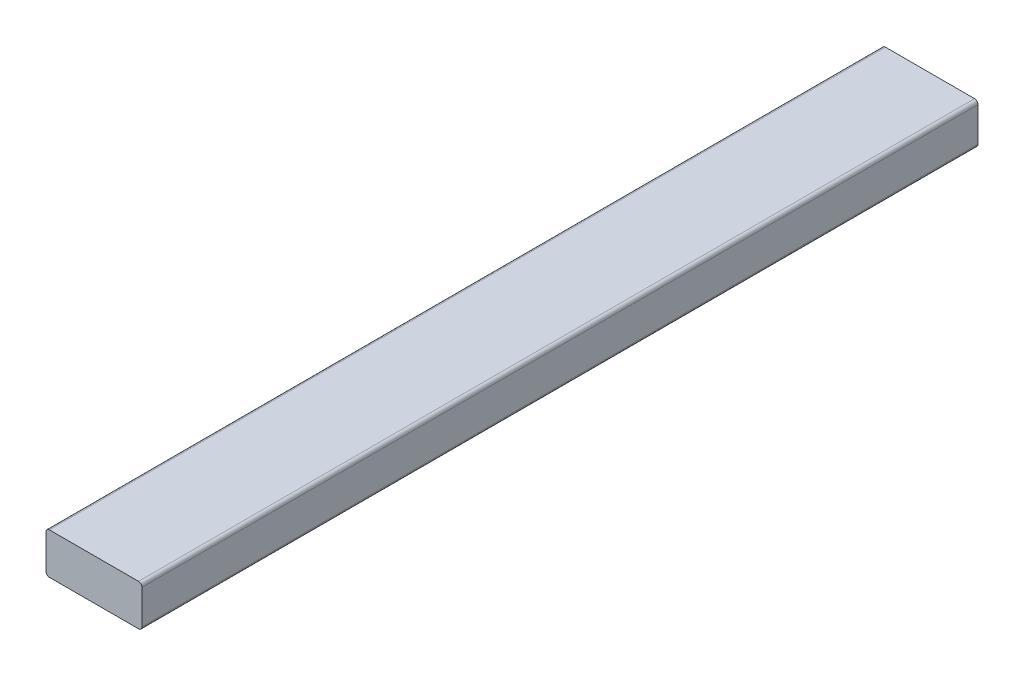
ISO-10303-21;
HEADER;
FILE_DESCRIPTION(('STEP AP214'),'2;1');
FILE_NAME('part.step','',(''),(''),'','','');
FILE_SCHEMA(('AUTOMOTIVE_DESIGN { 1 0 10303 214 1 1 1 1 }'));
ENDSEC;
DATA;
#1=APPLICATION_CONTEXT('core data for automotive mechanical design processes');
#2=APPLICATION_PROTOCOL_DEFINITION('international standard','automotive_design',2000,#1);
#3=PRODUCT_CONTEXT('',#1,'mechanical');
#4=PRODUCT('Part','Part','',(#3));
#5=PRODUCT_RELATED_PRODUCT_CATEGORY('part','',(#4));
#6=PRODUCT_DEFINITION_FORMATION('','',#4);
#7=PRODUCT_DEFINITION_CONTEXT('part definition',#1,'design');
#8=PRODUCT_DEFINITION('design','',#6,#7);
#9=PRODUCT_DEFINITION_SHAPE('','',#8);
#10=(LENGTH_UNIT() NAMED_UNIT(*) SI_UNIT(.MILLI.,.METRE.));
#11=(NAMED_UNIT(*) PLANE_ANGLE_UNIT() SI_UNIT($,.RADIAN.));
#12=(NAMED_UNIT(*) SI_UNIT($,.STERADIAN.) SOLID_ANGLE_UNIT());
#13=UNCERTAINTY_MEASURE_WITH_UNIT(LENGTH_MEASURE(1.E-05),#10,'distance_accuracy_value','');
#14=(GEOMETRIC_REPRESENTATION_CONTEXT(3) GLOBAL_UNCERTAINTY_ASSIGNED_CONTEXT((#13)) GLOBAL_UNIT_ASSIGNED_CONTEXT((#10,
#11,#12)) REPRESENTATION_CONTEXT('',''));
#15=CARTESIAN_POINT('',(0.,0.,0.));
#16=DIRECTION('',(0.,0.,1.));
#17=DIRECTION('',(1.,0.,0.));
#18=AXIS2_PLACEMENT_3D('',#15,#16,#17);
#19=CARTESIAN_POINT('',(44.45,19.05,387.35));
#20=DIRECTION('',(-1.,0.,0.));
#21=DIRECTION('',(0.,0.,1.));
#22=AXIS2_PLACEMENT_3D('',#19,#20,#21);
#23=PLANE('',#22);
#24=DIRECTION('',(0.,1.,0.));
#25=VECTOR('',#24,1.);
#26=CARTESIAN_POINT('',(44.45,19.05,387.35));
#27=LINE('',#26,#25);
#28=CARTESIAN_POINT('',(44.45,-15.875,387.35));
#29=VERTEX_POINT('',#28);
#30=CARTESIAN_POINT('',(44.45,15.875,387.35));
#31=VERTEX_POINT('',#30);
#32=EDGE_CURVE('E119',#29,#31,#27,.T.);
#33=ORIENTED_EDGE('',*,*,#32,.F.);
#34=DIRECTION('',(0.,0.,-1.));
#35=VECTOR('',#34,1.);
#36=CARTESIAN_POINT('',(44.45,-15.875,387.35));
#37=LINE('',#36,#35);
#38=CARTESIAN_POINT('',(44.45,-15.875,-387.35));
#39=VERTEX_POINT('',#38);
#40=EDGE_CURVE('E104',#29,#39,#37,.T.);
#41=ORIENTED_EDGE('',*,*,#40,.T.);
#42=DIRECTION('',(0.,1.,0.));
#43=VECTOR('',#42,1.);
#44=CARTESIAN_POINT('',(44.45,19.05,-387.35));
#45=LINE('',#44,#43);
#46=CARTESIAN_POINT('',(44.45,15.875,-387.35));
#47=VERTEX_POINT('',#46);
#48=EDGE_CURVE('E116',#39,#47,#45,.T.);
#49=ORIENTED_EDGE('',*,*,#48,.T.);
#50=DIRECTION('',(0.,0.,-1.));
#51=VECTOR('',#50,1.);
#52=CARTESIAN_POINT('',(44.45,15.875,387.35));
#53=LINE('',#52,#51);
#54=EDGE_CURVE('E121',#47,#31,#53,.F.);
#55=ORIENTED_EDGE('',*,*,#54,.T.);
#56=EDGE_LOOP('',(#33,#41,#49,#55));
#57=FACE_BOUND('',#56,.T.);
#58=ADVANCED_FACE('F34',(#57),#23,.F.);
#59=CARTESIAN_POINT('',(-44.45,19.05,387.35));
#60=DIRECTION('',(0.,-1.,0.));
#61=DIRECTION('',(0.,0.,-1.));
#62=AXIS2_PLACEMENT_3D('',#59,#60,#61);
#63=PLANE('',#62);
#64=DIRECTION('',(-1.,0.,0.));
#65=VECTOR('',#64,1.);
#66=CARTESIAN_POINT('',(-44.45,19.05,-387.35));
#67=LINE('',#66,#65);
#68=CARTESIAN_POINT('',(41.275,19.05,-387.35));
#69=VERTEX_POINT('',#68);
#70=CARTESIAN_POINT('',(-41.275,19.05,-387.35));
#71=VERTEX_POINT('',#70);
#72=EDGE_CURVE('E125',#69,#71,#67,.T.);
#73=ORIENTED_EDGE('',*,*,#72,.T.);
#74=DIRECTION('',(0.,0.,-1.));
#75=VECTOR('',#74,1.);
#76=CARTESIAN_POINT('',(-41.275,19.05,387.35));
#77=LINE('',#76,#75);
#78=CARTESIAN_POINT('',(-41.275,19.05,387.35));
#79=VERTEX_POINT('',#78);
#80=EDGE_CURVE('E11',#71,#79,#77,.F.);
#81=ORIENTED_EDGE('',*,*,#80,.T.);
#82=DIRECTION('',(-1.,0.,0.));
#83=VECTOR('',#82,1.);
#84=CARTESIAN_POINT('',(-44.45,19.05,387.35));
#85=LINE('',#84,#83);
#86=CARTESIAN_POINT('',(41.275,19.05,387.35));
#87=VERTEX_POINT('',#86);
#88=EDGE_CURVE('E161',#87,#79,#85,.T.);
#89=ORIENTED_EDGE('',*,*,#88,.F.);
#90=DIRECTION('',(0.,0.,-1.));
#91=VECTOR('',#90,1.);
#92=CARTESIAN_POINT('',(41.275,19.05,387.35));
#93=LINE('',#92,#91);
#94=EDGE_CURVE('E42',#87,#69,#93,.T.);
#95=ORIENTED_EDGE('',*,*,#94,.T.);
#96=EDGE_LOOP('',(#73,#81,#89,#95));
#97=FACE_BOUND('',#96,.T.);
#98=ADVANCED_FACE('F159',(#97),#63,.F.);
#99=CARTESIAN_POINT('',(-44.45,19.05,387.35));
#100=DIRECTION('',(1.,0.,0.));
#101=DIRECTION('',(0.,0.,-1.));
#102=AXIS2_PLACEMENT_3D('',#99,#100,#101);
#103=PLANE('',#102);
#104=DIRECTION('',(0.,-1.,0.));
#105=VECTOR('',#104,1.);
#106=CARTESIAN_POINT('',(-44.45,19.05,-387.35));
#107=LINE('',#106,#105);
#108=CARTESIAN_POINT('',(-44.45,15.875,-387.35));
#109=VERTEX_POINT('',#108);
#110=CARTESIAN_POINT('',(-44.45,-15.875,-387.35));
#111=VERTEX_POINT('',#110);
#112=EDGE_CURVE('E128',#109,#111,#107,.T.);
#113=ORIENTED_EDGE('',*,*,#112,.T.);
#114=DIRECTION('',(0.,0.,-1.));
#115=VECTOR('',#114,1.);
#116=CARTESIAN_POINT('',(-44.45,-15.875,387.35));
#117=LINE('',#116,#115);
#118=CARTESIAN_POINT('',(-44.45,-15.875,387.35));
#119=VERTEX_POINT('',#118);
#120=EDGE_CURVE('E49',#111,#119,#117,.F.);
#121=ORIENTED_EDGE('',*,*,#120,.T.);
#122=DIRECTION('',(0.,-1.,0.));
#123=VECTOR('',#122,1.);
#124=CARTESIAN_POINT('',(-44.45,19.05,387.35));
#125=LINE('',#124,#123);
#126=CARTESIAN_POINT('',(-44.45,15.875,387.35));
#127=VERTEX_POINT('',#126);
#128=EDGE_CURVE('E169',#127,#119,#125,.T.);
#129=ORIENTED_EDGE('',*,*,#128,.F.);
#130=DIRECTION('',(0.,0.,-1.));
#131=VECTOR('',#130,1.);
#132=CARTESIAN_POINT('',(-44.45,15.875,387.35));
#133=LINE('',#132,#131);
#134=EDGE_CURVE('E152',#127,#109,#133,.T.);
#135=ORIENTED_EDGE('',*,*,#134,.T.);
#136=EDGE_LOOP('',(#113,#121,#129,#135));
#137=FACE_BOUND('',#136,.T.);
#138=ADVANCED_FACE('F168',(#137),#103,.F.);
#139=CARTESIAN_POINT('',(-44.45,-19.05,387.35));
#140=DIRECTION('',(0.,1.,0.));
#141=DIRECTION('',(0.,0.,1.));
#142=AXIS2_PLACEMENT_3D('',#139,#140,#141);
#143=PLANE('',#142);
#144=DIRECTION('',(1.,0.,0.));
#145=VECTOR('',#144,1.);
#146=CARTESIAN_POINT('',(-44.45,-19.05,-387.35));
#147=LINE('',#146,#145);
#148=CARTESIAN_POINT('',(-41.275,-19.05,-387.35));
#149=VERTEX_POINT('',#148);
#150=CARTESIAN_POINT('',(41.275,-19.05,-387.35));
#151=VERTEX_POINT('',#150);
#152=EDGE_CURVE('E135',#149,#151,#147,.T.);
#153=ORIENTED_EDGE('',*,*,#152,.T.);
#154=DIRECTION('',(0.,0.,-1.));
#155=VECTOR('',#154,1.);
#156=CARTESIAN_POINT('',(41.275,-19.05,387.35));
#157=LINE('',#156,#155);
#158=CARTESIAN_POINT('',(41.275,-19.05,387.35));
#159=VERTEX_POINT('',#158);
#160=EDGE_CURVE('E105',#151,#159,#157,.F.);
#161=ORIENTED_EDGE('',*,*,#160,.T.);
#162=DIRECTION('',(1.,0.,0.));
#163=VECTOR('',#162,1.);
#164=CARTESIAN_POINT('',(-44.45,-19.05,387.35));
#165=LINE('',#164,#163);
#166=CARTESIAN_POINT('',(-41.275,-19.05,387.35));
#167=VERTEX_POINT('',#166);
#168=EDGE_CURVE('E131',#167,#159,#165,.T.);
#169=ORIENTED_EDGE('',*,*,#168,.F.);
#170=DIRECTION('',(0.,0.,-1.));
#171=VECTOR('',#170,1.);
#172=CARTESIAN_POINT('',(-41.275,-19.05,387.35));
#173=LINE('',#172,#171);
#174=EDGE_CURVE('E110',#167,#149,#173,.T.);
#175=ORIENTED_EDGE('',*,*,#174,.T.);
#176=EDGE_LOOP('',(#153,#161,#169,#175));
#177=FACE_BOUND('',#176,.T.);
#178=ADVANCED_FACE('F197',(#177),#143,.F.);
#179=CARTESIAN_POINT('',(0.,0.,387.35));
#180=DIRECTION('',(0.,0.,1.));
#181=DIRECTION('',(1.,0.,0.));
#182=AXIS2_PLACEMENT_3D('',#179,#180,#181);
#183=PLANE('',#182);
#184=ORIENTED_EDGE('',*,*,#168,.T.);
#185=CARTESIAN_POINT('',(41.275,-15.875,387.35));
#186=DIRECTION('',(0.,0.,1.));
#187=DIRECTION('',(1.,0.,0.));
#188=AXIS2_PLACEMENT_3D('',#185,#186,#187);
#189=CIRCLE('',#188,3.175);
#190=EDGE_CURVE('E150',#159,#29,#189,.T.);
#191=ORIENTED_EDGE('',*,*,#190,.T.);
#192=ORIENTED_EDGE('',*,*,#32,.T.);
#193=CARTESIAN_POINT('',(41.275,15.875,387.35));
#194=DIRECTION('',(0.,0.,1.));
#195=DIRECTION('',(1.,0.,0.));
#196=AXIS2_PLACEMENT_3D('',#193,#194,#195);
#197=CIRCLE('',#196,3.175);
#198=EDGE_CURVE('E145',#31,#87,#197,.T.);
#199=ORIENTED_EDGE('',*,*,#198,.T.);
#200=ORIENTED_EDGE('',*,*,#88,.T.);
#201=CARTESIAN_POINT('',(-41.275,15.875,387.35));
#202=DIRECTION('',(0.,0.,1.));
#203=DIRECTION('',(1.,0.,0.));
#204=AXIS2_PLACEMENT_3D('',#201,#202,#203);
#205=CIRCLE('',#204,3.175);
#206=EDGE_CURVE('E56',#79,#127,#205,.T.);
#207=ORIENTED_EDGE('',*,*,#206,.T.);
#208=ORIENTED_EDGE('',*,*,#128,.T.);
#209=CARTESIAN_POINT('',(-41.275,-15.875,387.35));
#210=DIRECTION('',(0.,0.,1.));
#211=DIRECTION('',(1.,0.,0.));
#212=AXIS2_PLACEMENT_3D('',#209,#210,#211);
#213=CIRCLE('',#212,3.175);
#214=EDGE_CURVE('E148',#119,#167,#213,.T.);
#215=ORIENTED_EDGE('',*,*,#214,.T.);
#216=EDGE_LOOP('',(#184,#191,#192,#199,#200,#207,#208,#215));
#217=FACE_BOUND('',#216,.T.);
#218=ADVANCED_FACE('F174',(#217),#183,.T.);
#219=CARTESIAN_POINT('',(0.,0.,-387.35));
#220=DIRECTION('',(0.,0.,1.));
#221=DIRECTION('',(1.,0.,0.));
#222=AXIS2_PLACEMENT_3D('',#219,#220,#221);
#223=PLANE('',#222);
#224=ORIENTED_EDGE('',*,*,#48,.F.);
#225=CARTESIAN_POINT('',(41.275,-15.875,-387.35));
#226=DIRECTION('',(0.,0.,1.));
#227=DIRECTION('',(1.,0.,0.));
#228=AXIS2_PLACEMENT_3D('',#225,#226,#227);
#229=CIRCLE('',#228,3.175);
#230=EDGE_CURVE('E100',#39,#151,#229,.F.);
#231=ORIENTED_EDGE('',*,*,#230,.T.);
#232=ORIENTED_EDGE('',*,*,#152,.F.);
#233=CARTESIAN_POINT('',(-41.275,-15.875,-387.35));
#234=DIRECTION('',(0.,0.,1.));
#235=DIRECTION('',(1.,0.,0.));
#236=AXIS2_PLACEMENT_3D('',#233,#234,#235);
#237=CIRCLE('',#236,3.175);
#238=EDGE_CURVE('E111',#149,#111,#237,.F.);
#239=ORIENTED_EDGE('',*,*,#238,.T.);
#240=ORIENTED_EDGE('',*,*,#112,.F.);
#241=CARTESIAN_POINT('',(-41.275,15.875,-387.35));
#242=DIRECTION('',(0.,0.,1.));
#243=DIRECTION('',(1.,0.,0.));
#244=AXIS2_PLACEMENT_3D('',#241,#242,#243);
#245=CIRCLE('',#244,3.175);
#246=EDGE_CURVE('E139',#109,#71,#245,.F.);
#247=ORIENTED_EDGE('',*,*,#246,.T.);
#248=ORIENTED_EDGE('',*,*,#72,.F.);
#249=CARTESIAN_POINT('',(41.275,15.875,-387.35));
#250=DIRECTION('',(0.,0.,1.));
#251=DIRECTION('',(1.,0.,0.));
#252=AXIS2_PLACEMENT_3D('',#249,#250,#251);
#253=CIRCLE('',#252,3.175);
#254=EDGE_CURVE('E120',#69,#47,#253,.F.);
#255=ORIENTED_EDGE('',*,*,#254,.T.);
#256=EDGE_LOOP('',(#224,#231,#232,#239,#240,#247,#248,#255));
#257=FACE_BOUND('',#256,.T.);
#258=ADVANCED_FACE('F123',(#257),#223,.F.);
#259=CARTESIAN_POINT('',(41.275,-15.875,387.35));
#260=DIRECTION('',(0.,0.,-1.));
#261=DIRECTION('',(-1.,0.,0.));
#262=AXIS2_PLACEMENT_3D('',#259,#260,#261);
#263=CYLINDRICAL_SURFACE('',#262,3.175);
#264=ORIENTED_EDGE('',*,*,#190,.F.);
#265=ORIENTED_EDGE('',*,*,#160,.F.);
#266=ORIENTED_EDGE('',*,*,#230,.F.);
#267=ORIENTED_EDGE('',*,*,#40,.F.);
#268=EDGE_LOOP('',(#264,#265,#266,#267));
#269=FACE_BOUND('',#268,.T.);
#270=ADVANCED_FACE('F103',(#269),#263,.T.);
#271=CARTESIAN_POINT('',(-41.275,-15.875,387.35));
#272=DIRECTION('',(0.,0.,-1.));
#273=DIRECTION('',(-1.,0.,0.));
#274=AXIS2_PLACEMENT_3D('',#271,#272,#273);
#275=CYLINDRICAL_SURFACE('',#274,3.175);
#276=ORIENTED_EDGE('',*,*,#214,.F.);
#277=ORIENTED_EDGE('',*,*,#120,.F.);
#278=ORIENTED_EDGE('',*,*,#238,.F.);
#279=ORIENTED_EDGE('',*,*,#174,.F.);
#280=EDGE_LOOP('',(#276,#277,#278,#279));
#281=FACE_BOUND('',#280,.T.);
#282=ADVANCED_FACE('F179',(#281),#275,.T.);
#283=CARTESIAN_POINT('',(-41.275,15.875,387.35));
#284=DIRECTION('',(0.,0.,-1.));
#285=DIRECTION('',(-1.,0.,0.));
#286=AXIS2_PLACEMENT_3D('',#283,#284,#285);
#287=CYLINDRICAL_SURFACE('',#286,3.175);
#288=ORIENTED_EDGE('',*,*,#206,.F.);
#289=ORIENTED_EDGE('',*,*,#80,.F.);
#290=ORIENTED_EDGE('',*,*,#246,.F.);
#291=ORIENTED_EDGE('',*,*,#134,.F.);
#292=EDGE_LOOP('',(#288,#289,#290,#291));
#293=FACE_BOUND('',#292,.T.);
#294=ADVANCED_FACE('F167',(#293),#287,.T.);
#295=CARTESIAN_POINT('',(41.275,15.875,387.35));
#296=DIRECTION('',(0.,0.,-1.));
#297=DIRECTION('',(-1.,0.,0.));
#298=AXIS2_PLACEMENT_3D('',#295,#296,#297);
#299=CYLINDRICAL_SURFACE('',#298,3.175);
#300=ORIENTED_EDGE('',*,*,#198,.F.);
#301=ORIENTED_EDGE('',*,*,#54,.F.);
#302=ORIENTED_EDGE('',*,*,#254,.F.);
#303=ORIENTED_EDGE('',*,*,#94,.F.);
#304=EDGE_LOOP('',(#300,#301,#302,#303));
#305=FACE_BOUND('',#304,.T.);
#306=ADVANCED_FACE('F36',(#305),#299,.T.);
#307=CLOSED_SHELL('',(#58,#98,#138,#178,#218,#258,#270,#282,#294,#306));
#308=MANIFOLD_SOLID_BREP('B2',#307);
#309=ADVANCED_BREP_SHAPE_REPRESENTATION('',(#18,#308),#14);
#310=SHAPE_DEFINITION_REPRESENTATION(#9,#309);
ENDSEC;
END-ISO-10303-21;
